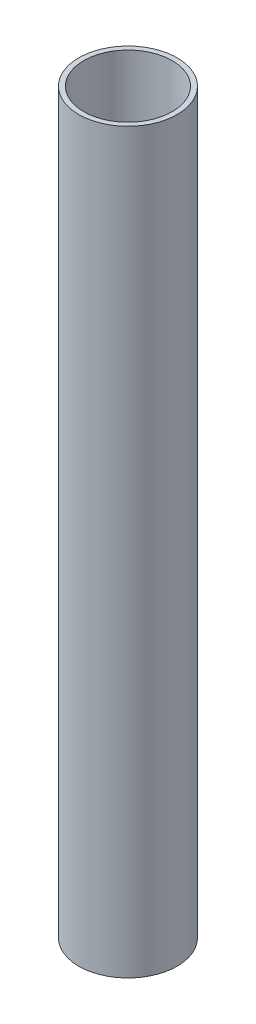
ISO-10303-21;
HEADER;
FILE_DESCRIPTION(('STEP AP214'),'2;1');
FILE_NAME('part.step','',(''),(''),'','','');
FILE_SCHEMA(('AUTOMOTIVE_DESIGN { 1 0 10303 214 1 1 1 1 }'));
ENDSEC;
DATA;
#1=APPLICATION_CONTEXT('core data for automotive mechanical design processes');
#2=APPLICATION_PROTOCOL_DEFINITION('international standard','automotive_design',2000,#1);
#3=PRODUCT_CONTEXT('',#1,'mechanical');
#4=PRODUCT('Part','Part','',(#3));
#5=PRODUCT_RELATED_PRODUCT_CATEGORY('part','',(#4));
#6=PRODUCT_DEFINITION_FORMATION('','',#4);
#7=PRODUCT_DEFINITION_CONTEXT('part definition',#1,'design');
#8=PRODUCT_DEFINITION('design','',#6,#7);
#9=PRODUCT_DEFINITION_SHAPE('','',#8);
#10=(LENGTH_UNIT() NAMED_UNIT(*) SI_UNIT(.MILLI.,.METRE.));
#11=(NAMED_UNIT(*) PLANE_ANGLE_UNIT() SI_UNIT($,.RADIAN.));
#12=(NAMED_UNIT(*) SI_UNIT($,.STERADIAN.) SOLID_ANGLE_UNIT());
#13=UNCERTAINTY_MEASURE_WITH_UNIT(LENGTH_MEASURE(1.E-05),#10,'distance_accuracy_value','');
#14=(GEOMETRIC_REPRESENTATION_CONTEXT(3) GLOBAL_UNCERTAINTY_ASSIGNED_CONTEXT((#13)) GLOBAL_UNIT_ASSIGNED_CONTEXT((#10,
#11,#12)) REPRESENTATION_CONTEXT('',''));
#15=CARTESIAN_POINT('',(0.,0.,0.));
#16=DIRECTION('',(0.,0.,1.));
#17=DIRECTION('',(1.,0.,0.));
#18=AXIS2_PLACEMENT_3D('',#15,#16,#17);
#19=CARTESIAN_POINT('',(0.,300.,0.));
#20=DIRECTION('',(0.,1.,0.));
#21=DIRECTION('',(0.,0.,1.));
#22=AXIS2_PLACEMENT_3D('',#19,#20,#21);
#23=PLANE('',#22);
#24=CARTESIAN_POINT('',(0.,300.,0.));
#25=DIRECTION('',(0.,1.,0.));
#26=DIRECTION('',(0.,0.,1.));
#27=AXIS2_PLACEMENT_3D('',#24,#25,#26);
#28=CIRCLE('',#27,20.);
#29=CARTESIAN_POINT('',(0.,300.,20.));
#30=VERTEX_POINT('',#29);
#31=EDGE_CURVE('E10',#30,#30,#28,.T.);
#32=ORIENTED_EDGE('',*,*,#31,.T.);
#33=EDGE_LOOP('',(#32));
#34=FACE_BOUND('',#33,.T.);
#35=CARTESIAN_POINT('',(0.,300.,0.));
#36=DIRECTION('',(0.,1.,0.));
#37=DIRECTION('',(0.,0.,1.));
#38=AXIS2_PLACEMENT_3D('',#35,#36,#37);
#39=CIRCLE('',#38,18.);
#40=CARTESIAN_POINT('',(0.,300.,18.));
#41=VERTEX_POINT('',#40);
#42=EDGE_CURVE('E52',#41,#41,#39,.T.);
#43=ORIENTED_EDGE('',*,*,#42,.F.);
#44=EDGE_LOOP('',(#43));
#45=FACE_BOUND('',#44,.T.);
#46=ADVANCED_FACE('F39',(#34,#45),#23,.T.);
#47=CARTESIAN_POINT('',(0.,0.,0.));
#48=DIRECTION('',(0.,1.,0.));
#49=DIRECTION('',(0.,0.,1.));
#50=AXIS2_PLACEMENT_3D('',#47,#48,#49);
#51=PLANE('',#50);
#52=CARTESIAN_POINT('',(0.,0.,0.));
#53=DIRECTION('',(0.,1.,0.));
#54=DIRECTION('',(0.,0.,1.));
#55=AXIS2_PLACEMENT_3D('',#52,#53,#54);
#56=CIRCLE('',#55,20.);
#57=CARTESIAN_POINT('',(0.,0.,20.));
#58=VERTEX_POINT('',#57);
#59=EDGE_CURVE('E43',#58,#58,#56,.T.);
#60=ORIENTED_EDGE('',*,*,#59,.F.);
#61=EDGE_LOOP('',(#60));
#62=FACE_BOUND('',#61,.T.);
#63=CARTESIAN_POINT('',(0.,0.,0.));
#64=DIRECTION('',(0.,1.,0.));
#65=DIRECTION('',(0.,0.,1.));
#66=AXIS2_PLACEMENT_3D('',#63,#64,#65);
#67=CIRCLE('',#66,18.);
#68=CARTESIAN_POINT('',(0.,0.,18.));
#69=VERTEX_POINT('',#68);
#70=EDGE_CURVE('E54',#69,#69,#67,.T.);
#71=ORIENTED_EDGE('',*,*,#70,.T.);
#72=EDGE_LOOP('',(#71));
#73=FACE_BOUND('',#72,.T.);
#74=ADVANCED_FACE('F66',(#62,#73),#51,.F.);
#75=CARTESIAN_POINT('',(0.,300.,0.));
#76=DIRECTION('',(0.,-1.,0.));
#77=DIRECTION('',(0.,0.,-1.));
#78=AXIS2_PLACEMENT_3D('',#75,#76,#77);
#79=CYLINDRICAL_SURFACE('',#78,20.);
#80=ORIENTED_EDGE('',*,*,#31,.F.);
#81=EDGE_LOOP('',(#80));
#82=FACE_BOUND('',#81,.T.);
#83=ORIENTED_EDGE('',*,*,#59,.T.);
#84=EDGE_LOOP('',(#83));
#85=FACE_BOUND('',#84,.T.);
#86=ADVANCED_FACE('F41',(#82,#85),#79,.T.);
#87=CARTESIAN_POINT('',(0.,300.,0.));
#88=DIRECTION('',(0.,-1.,0.));
#89=DIRECTION('',(0.,0.,-1.));
#90=AXIS2_PLACEMENT_3D('',#87,#88,#89);
#91=CYLINDRICAL_SURFACE('',#90,18.);
#92=ORIENTED_EDGE('',*,*,#42,.T.);
#93=EDGE_LOOP('',(#92));
#94=FACE_BOUND('',#93,.T.);
#95=ORIENTED_EDGE('',*,*,#70,.F.);
#96=EDGE_LOOP('',(#95));
#97=FACE_BOUND('',#96,.T.);
#98=ADVANCED_FACE('F62',(#94,#97),#91,.F.);
#99=CLOSED_SHELL('',(#46,#74,#86,#98));
#100=MANIFOLD_SOLID_BREP('B2',#99);
#101=ADVANCED_BREP_SHAPE_REPRESENTATION('',(#18,#100),#14);
#102=SHAPE_DEFINITION_REPRESENTATION(#9,#101);
ENDSEC;
END-ISO-10303-21;
